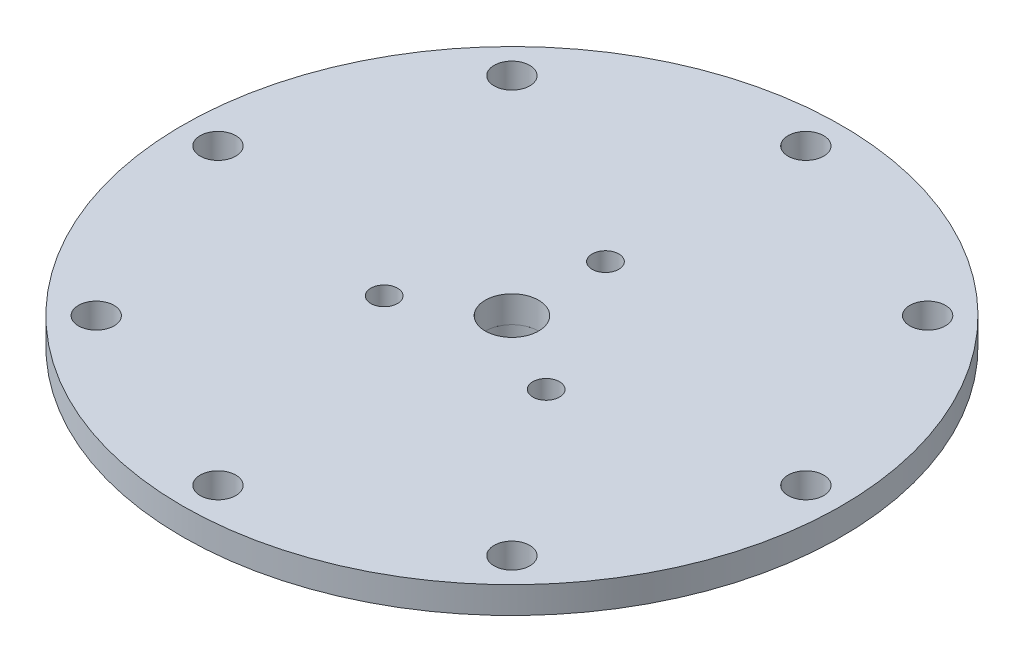
ISO-10303-21;
HEADER;
FILE_DESCRIPTION(('STEP AP214'),'2;1');
FILE_NAME('part.step','',(''),(''),'','','');
FILE_SCHEMA(('AUTOMOTIVE_DESIGN { 1 0 10303 214 1 1 1 1 }'));
ENDSEC;
DATA;
#1=APPLICATION_CONTEXT('core data for automotive mechanical design processes');
#2=APPLICATION_PROTOCOL_DEFINITION('international standard','automotive_design',2000,#1);
#3=PRODUCT_CONTEXT('',#1,'mechanical');
#4=PRODUCT('Part','Part','',(#3));
#5=PRODUCT_RELATED_PRODUCT_CATEGORY('part','',(#4));
#6=PRODUCT_DEFINITION_FORMATION('','',#4);
#7=PRODUCT_DEFINITION_CONTEXT('part definition',#1,'design');
#8=PRODUCT_DEFINITION('design','',#6,#7);
#9=PRODUCT_DEFINITION_SHAPE('','',#8);
#10=(LENGTH_UNIT() NAMED_UNIT(*) SI_UNIT(.MILLI.,.METRE.));
#11=(NAMED_UNIT(*) PLANE_ANGLE_UNIT() SI_UNIT($,.RADIAN.));
#12=(NAMED_UNIT(*) SI_UNIT($,.STERADIAN.) SOLID_ANGLE_UNIT());
#13=UNCERTAINTY_MEASURE_WITH_UNIT(LENGTH_MEASURE(1.E-05),#10,'distance_accuracy_value','');
#14=(GEOMETRIC_REPRESENTATION_CONTEXT(3) GLOBAL_UNCERTAINTY_ASSIGNED_CONTEXT((#13)) GLOBAL_UNIT_ASSIGNED_CONTEXT((#10,
#11,#12)) REPRESENTATION_CONTEXT('',''));
#15=CARTESIAN_POINT('',(0.,0.,0.));
#16=DIRECTION('',(0.,0.,1.));
#17=DIRECTION('',(1.,0.,0.));
#18=AXIS2_PLACEMENT_3D('',#15,#16,#17);
#19=CARTESIAN_POINT('',(0.,-6.23678090575275,0.));
#20=DIRECTION('',(0.,1.,0.));
#21=DIRECTION('',(0.,0.,1.));
#22=AXIS2_PLACEMENT_3D('',#19,#20,#21);
#23=PLANE('',#22);
#24=CARTESIAN_POINT('',(0.,-6.23678090575275,-33.));
#25=DIRECTION('',(0.,1.,0.));
#26=DIRECTION('',(0.,0.,1.));
#27=AXIS2_PLACEMENT_3D('',#24,#25,#26);
#28=CIRCLE('',#27,2.);
#29=CARTESIAN_POINT('',(0.,-6.23678090575275,-31.));
#30=VERTEX_POINT('',#29);
#31=EDGE_CURVE('E113',#30,#30,#28,.T.);
#32=ORIENTED_EDGE('',*,*,#31,.F.);
#33=EDGE_LOOP('',(#32));
#34=FACE_BOUND('',#33,.T.);
#35=CARTESIAN_POINT('',(-33.,-6.23678090575275,0.));
#36=DIRECTION('',(0.,1.,0.));
#37=DIRECTION('',(0.,0.,1.));
#38=AXIS2_PLACEMENT_3D('',#35,#36,#37);
#39=CIRCLE('',#38,2.00000000000001);
#40=CARTESIAN_POINT('',(-33.,-6.23678090575275,2.00000000000001));
#41=VERTEX_POINT('',#40);
#42=EDGE_CURVE('E101',#41,#41,#39,.T.);
#43=ORIENTED_EDGE('',*,*,#42,.F.);
#44=EDGE_LOOP('',(#43));
#45=FACE_BOUND('',#44,.T.);
#46=CARTESIAN_POINT('',(0.,-6.23678090575275,33.));
#47=DIRECTION('',(0.,1.,0.));
#48=DIRECTION('',(0.,0.,1.));
#49=AXIS2_PLACEMENT_3D('',#46,#47,#48);
#50=CIRCLE('',#49,2.);
#51=CARTESIAN_POINT('',(0.,-6.23678090575275,35.));
#52=VERTEX_POINT('',#51);
#53=EDGE_CURVE('E89',#52,#52,#50,.T.);
#54=ORIENTED_EDGE('',*,*,#53,.F.);
#55=EDGE_LOOP('',(#54));
#56=FACE_BOUND('',#55,.T.);
#57=CARTESIAN_POINT('',(33.,-6.23678090575275,0.));
#58=DIRECTION('',(0.,1.,0.));
#59=DIRECTION('',(0.,0.,1.));
#60=AXIS2_PLACEMENT_3D('',#57,#58,#59);
#61=CIRCLE('',#60,2.);
#62=CARTESIAN_POINT('',(33.,-6.23678090575275,2.));
#63=VERTEX_POINT('',#62);
#64=EDGE_CURVE('E77',#63,#63,#61,.T.);
#65=ORIENTED_EDGE('',*,*,#64,.F.);
#66=EDGE_LOOP('',(#65));
#67=FACE_BOUND('',#66,.T.);
#68=CARTESIAN_POINT('',(-9.09326673973658,-6.23678090575275,5.25000000000004));
#69=DIRECTION('',(0.,1.,0.));
#70=DIRECTION('',(0.,0.,1.));
#71=AXIS2_PLACEMENT_3D('',#68,#69,#70);
#72=CIRCLE('',#71,1.5);
#73=CARTESIAN_POINT('',(-9.09326673973658,-6.23678090575275,6.75000000000005));
#74=VERTEX_POINT('',#73);
#75=EDGE_CURVE('E65',#74,#74,#72,.T.);
#76=ORIENTED_EDGE('',*,*,#75,.F.);
#77=EDGE_LOOP('',(#76));
#78=FACE_BOUND('',#77,.T.);
#79=CARTESIAN_POINT('',(0.,-6.23678090575275,-10.5));
#80=DIRECTION('',(0.,1.,0.));
#81=DIRECTION('',(0.,0.,1.));
#82=AXIS2_PLACEMENT_3D('',#79,#80,#81);
#83=CIRCLE('',#82,1.5);
#84=CARTESIAN_POINT('',(0.,-6.23678090575275,-9.));
#85=VERTEX_POINT('',#84);
#86=EDGE_CURVE('E54',#85,#85,#83,.T.);
#87=ORIENTED_EDGE('',*,*,#86,.F.);
#88=EDGE_LOOP('',(#87));
#89=FACE_BOUND('',#88,.T.);
#90=CARTESIAN_POINT('',(0.,-6.23678090575275,0.));
#91=DIRECTION('',(0.,1.,0.));
#92=DIRECTION('',(0.,0.,1.));
#93=AXIS2_PLACEMENT_3D('',#90,#91,#92);
#94=CIRCLE('',#93,37.);
#95=CARTESIAN_POINT('',(0.,-6.23678090575275,37.));
#96=VERTEX_POINT('',#95);
#97=EDGE_CURVE('E11',#96,#96,#94,.T.);
#98=ORIENTED_EDGE('',*,*,#97,.T.);
#99=EDGE_LOOP('',(#98));
#100=FACE_BOUND('',#99,.T.);
#101=CARTESIAN_POINT('',(9.09326673973662,-6.23678090575275,5.24999999999998));
#102=DIRECTION('',(0.,1.,0.));
#103=DIRECTION('',(0.,0.,1.));
#104=AXIS2_PLACEMENT_3D('',#101,#102,#103);
#105=CIRCLE('',#104,1.5);
#106=CARTESIAN_POINT('',(9.09326673973662,-6.23678090575275,6.74999999999998));
#107=VERTEX_POINT('',#106);
#108=EDGE_CURVE('E59',#107,#107,#105,.T.);
#109=ORIENTED_EDGE('',*,*,#108,.F.);
#110=EDGE_LOOP('',(#109));
#111=FACE_BOUND('',#110,.T.);
#112=CARTESIAN_POINT('',(0.,-6.23678090575275,0.));
#113=DIRECTION('',(0.,1.,0.));
#114=DIRECTION('',(0.,0.,1.));
#115=AXIS2_PLACEMENT_3D('',#112,#113,#114);
#116=CIRCLE('',#115,3.);
#117=CARTESIAN_POINT('',(0.,-6.23678090575275,3.));
#118=VERTEX_POINT('',#117);
#119=EDGE_CURVE('E71',#118,#118,#116,.T.);
#120=ORIENTED_EDGE('',*,*,#119,.F.);
#121=EDGE_LOOP('',(#120));
#122=FACE_BOUND('',#121,.T.);
#123=CARTESIAN_POINT('',(23.3345237791561,-6.23678090575275,23.3345237791561));
#124=DIRECTION('',(0.,1.,0.));
#125=DIRECTION('',(0.,0.,1.));
#126=AXIS2_PLACEMENT_3D('',#123,#124,#125);
#127=CIRCLE('',#126,2.00000000000001);
#128=CARTESIAN_POINT('',(23.3345237791561,-6.23678090575275,25.3345237791561));
#129=VERTEX_POINT('',#128);
#130=EDGE_CURVE('E83',#129,#129,#127,.T.);
#131=ORIENTED_EDGE('',*,*,#130,.F.);
#132=EDGE_LOOP('',(#131));
#133=FACE_BOUND('',#132,.T.);
#134=CARTESIAN_POINT('',(-23.3345237791561,-6.23678090575275,23.3345237791561));
#135=DIRECTION('',(0.,1.,0.));
#136=DIRECTION('',(0.,0.,1.));
#137=AXIS2_PLACEMENT_3D('',#134,#135,#136);
#138=CIRCLE('',#137,2.00000000000001);
#139=CARTESIAN_POINT('',(-23.3345237791561,-6.23678090575275,25.3345237791561));
#140=VERTEX_POINT('',#139);
#141=EDGE_CURVE('E95',#140,#140,#138,.T.);
#142=ORIENTED_EDGE('',*,*,#141,.F.);
#143=EDGE_LOOP('',(#142));
#144=FACE_BOUND('',#143,.T.);
#145=CARTESIAN_POINT('',(-23.3345237791561,-6.23678090575275,-23.3345237791561));
#146=DIRECTION('',(0.,1.,0.));
#147=DIRECTION('',(0.,0.,1.));
#148=AXIS2_PLACEMENT_3D('',#145,#146,#147);
#149=CIRCLE('',#148,2.00000000000001);
#150=CARTESIAN_POINT('',(-23.3345237791561,-6.23678090575275,-21.3345237791561));
#151=VERTEX_POINT('',#150);
#152=EDGE_CURVE('E107',#151,#151,#149,.T.);
#153=ORIENTED_EDGE('',*,*,#152,.F.);
#154=EDGE_LOOP('',(#153));
#155=FACE_BOUND('',#154,.T.);
#156=CARTESIAN_POINT('',(23.3345237791561,-6.23678090575275,-23.3345237791561));
#157=DIRECTION('',(0.,1.,0.));
#158=DIRECTION('',(0.,0.,1.));
#159=AXIS2_PLACEMENT_3D('',#156,#157,#158);
#160=CIRCLE('',#159,2.);
#161=CARTESIAN_POINT('',(23.3345237791561,-6.23678090575275,-21.3345237791561));
#162=VERTEX_POINT('',#161);
#163=EDGE_CURVE('E119',#162,#162,#160,.T.);
#164=ORIENTED_EDGE('',*,*,#163,.F.);
#165=EDGE_LOOP('',(#164));
#166=FACE_BOUND('',#165,.T.);
#167=ADVANCED_FACE('F43',(#34,#45,#56,#67,#78,#89,#100,#111,#122,#133,#144,#155,#166),#23,.T.);
#168=CARTESIAN_POINT('',(0.,-9.23678090575275,0.));
#169=DIRECTION('',(0.,1.,0.));
#170=DIRECTION('',(0.,0.,1.));
#171=AXIS2_PLACEMENT_3D('',#168,#169,#170);
#172=PLANE('',#171);
#173=CARTESIAN_POINT('',(0.,-9.23678090575275,0.));
#174=DIRECTION('',(0.,1.,0.));
#175=DIRECTION('',(0.,0.,1.));
#176=AXIS2_PLACEMENT_3D('',#173,#174,#175);
#177=CIRCLE('',#176,37.);
#178=CARTESIAN_POINT('',(0.,-9.23678090575275,37.));
#179=VERTEX_POINT('',#178);
#180=EDGE_CURVE('E47',#179,#179,#177,.T.);
#181=ORIENTED_EDGE('',*,*,#180,.F.);
#182=EDGE_LOOP('',(#181));
#183=FACE_BOUND('',#182,.T.);
#184=CARTESIAN_POINT('',(0.,-9.23678090575275,-10.5));
#185=DIRECTION('',(0.,1.,0.));
#186=DIRECTION('',(0.,0.,1.));
#187=AXIS2_PLACEMENT_3D('',#184,#185,#186);
#188=CIRCLE('',#187,1.5);
#189=CARTESIAN_POINT('',(0.,-9.23678090575275,-9.));
#190=VERTEX_POINT('',#189);
#191=EDGE_CURVE('E56',#190,#190,#188,.T.);
#192=ORIENTED_EDGE('',*,*,#191,.T.);
#193=EDGE_LOOP('',(#192));
#194=FACE_BOUND('',#193,.T.);
#195=CARTESIAN_POINT('',(9.09326673973662,-9.23678090575275,5.24999999999998));
#196=DIRECTION('',(0.,1.,0.));
#197=DIRECTION('',(0.,0.,1.));
#198=AXIS2_PLACEMENT_3D('',#195,#196,#197);
#199=CIRCLE('',#198,1.5);
#200=CARTESIAN_POINT('',(9.09326673973662,-9.23678090575275,6.74999999999998));
#201=VERTEX_POINT('',#200);
#202=EDGE_CURVE('E62',#201,#201,#199,.T.);
#203=ORIENTED_EDGE('',*,*,#202,.T.);
#204=EDGE_LOOP('',(#203));
#205=FACE_BOUND('',#204,.T.);
#206=CARTESIAN_POINT('',(-9.09326673973658,-9.23678090575275,5.25000000000004));
#207=DIRECTION('',(0.,1.,0.));
#208=DIRECTION('',(0.,0.,1.));
#209=AXIS2_PLACEMENT_3D('',#206,#207,#208);
#210=CIRCLE('',#209,1.5);
#211=CARTESIAN_POINT('',(-9.09326673973658,-9.23678090575275,6.75000000000005));
#212=VERTEX_POINT('',#211);
#213=EDGE_CURVE('E68',#212,#212,#210,.T.);
#214=ORIENTED_EDGE('',*,*,#213,.T.);
#215=EDGE_LOOP('',(#214));
#216=FACE_BOUND('',#215,.T.);
#217=CARTESIAN_POINT('',(0.,-9.23678090575275,0.));
#218=DIRECTION('',(0.,1.,0.));
#219=DIRECTION('',(0.,0.,1.));
#220=AXIS2_PLACEMENT_3D('',#217,#218,#219);
#221=CIRCLE('',#220,3.);
#222=CARTESIAN_POINT('',(0.,-9.23678090575275,3.));
#223=VERTEX_POINT('',#222);
#224=EDGE_CURVE('E74',#223,#223,#221,.T.);
#225=ORIENTED_EDGE('',*,*,#224,.T.);
#226=EDGE_LOOP('',(#225));
#227=FACE_BOUND('',#226,.T.);
#228=CARTESIAN_POINT('',(33.,-9.23678090575275,0.));
#229=DIRECTION('',(0.,1.,0.));
#230=DIRECTION('',(0.,0.,1.));
#231=AXIS2_PLACEMENT_3D('',#228,#229,#230);
#232=CIRCLE('',#231,2.);
#233=CARTESIAN_POINT('',(33.,-9.23678090575275,2.));
#234=VERTEX_POINT('',#233);
#235=EDGE_CURVE('E80',#234,#234,#232,.T.);
#236=ORIENTED_EDGE('',*,*,#235,.T.);
#237=EDGE_LOOP('',(#236));
#238=FACE_BOUND('',#237,.T.);
#239=CARTESIAN_POINT('',(23.3345237791561,-9.23678090575275,23.3345237791561));
#240=DIRECTION('',(0.,1.,0.));
#241=DIRECTION('',(0.,0.,1.));
#242=AXIS2_PLACEMENT_3D('',#239,#240,#241);
#243=CIRCLE('',#242,2.00000000000001);
#244=CARTESIAN_POINT('',(23.3345237791561,-9.23678090575275,25.3345237791561));
#245=VERTEX_POINT('',#244);
#246=EDGE_CURVE('E86',#245,#245,#243,.T.);
#247=ORIENTED_EDGE('',*,*,#246,.T.);
#248=EDGE_LOOP('',(#247));
#249=FACE_BOUND('',#248,.T.);
#250=CARTESIAN_POINT('',(0.,-9.23678090575275,33.));
#251=DIRECTION('',(0.,1.,0.));
#252=DIRECTION('',(0.,0.,1.));
#253=AXIS2_PLACEMENT_3D('',#250,#251,#252);
#254=CIRCLE('',#253,2.);
#255=CARTESIAN_POINT('',(0.,-9.23678090575275,35.));
#256=VERTEX_POINT('',#255);
#257=EDGE_CURVE('E92',#256,#256,#254,.T.);
#258=ORIENTED_EDGE('',*,*,#257,.T.);
#259=EDGE_LOOP('',(#258));
#260=FACE_BOUND('',#259,.T.);
#261=CARTESIAN_POINT('',(-23.3345237791561,-9.23678090575275,23.3345237791561));
#262=DIRECTION('',(0.,1.,0.));
#263=DIRECTION('',(0.,0.,1.));
#264=AXIS2_PLACEMENT_3D('',#261,#262,#263);
#265=CIRCLE('',#264,2.00000000000001);
#266=CARTESIAN_POINT('',(-23.3345237791561,-9.23678090575275,25.3345237791561));
#267=VERTEX_POINT('',#266);
#268=EDGE_CURVE('E98',#267,#267,#265,.T.);
#269=ORIENTED_EDGE('',*,*,#268,.T.);
#270=EDGE_LOOP('',(#269));
#271=FACE_BOUND('',#270,.T.);
#272=CARTESIAN_POINT('',(-33.,-9.23678090575275,0.));
#273=DIRECTION('',(0.,1.,0.));
#274=DIRECTION('',(0.,0.,1.));
#275=AXIS2_PLACEMENT_3D('',#272,#273,#274);
#276=CIRCLE('',#275,2.00000000000001);
#277=CARTESIAN_POINT('',(-33.,-9.23678090575275,2.00000000000001));
#278=VERTEX_POINT('',#277);
#279=EDGE_CURVE('E104',#278,#278,#276,.T.);
#280=ORIENTED_EDGE('',*,*,#279,.T.);
#281=EDGE_LOOP('',(#280));
#282=FACE_BOUND('',#281,.T.);
#283=CARTESIAN_POINT('',(-23.3345237791561,-9.23678090575275,-23.3345237791561));
#284=DIRECTION('',(0.,1.,0.));
#285=DIRECTION('',(0.,0.,1.));
#286=AXIS2_PLACEMENT_3D('',#283,#284,#285);
#287=CIRCLE('',#286,2.00000000000001);
#288=CARTESIAN_POINT('',(-23.3345237791561,-9.23678090575275,-21.3345237791561));
#289=VERTEX_POINT('',#288);
#290=EDGE_CURVE('E110',#289,#289,#287,.T.);
#291=ORIENTED_EDGE('',*,*,#290,.T.);
#292=EDGE_LOOP('',(#291));
#293=FACE_BOUND('',#292,.T.);
#294=CARTESIAN_POINT('',(0.,-9.23678090575275,-33.));
#295=DIRECTION('',(0.,1.,0.));
#296=DIRECTION('',(0.,0.,1.));
#297=AXIS2_PLACEMENT_3D('',#294,#295,#296);
#298=CIRCLE('',#297,2.);
#299=CARTESIAN_POINT('',(0.,-9.23678090575275,-31.));
#300=VERTEX_POINT('',#299);
#301=EDGE_CURVE('E116',#300,#300,#298,.T.);
#302=ORIENTED_EDGE('',*,*,#301,.T.);
#303=EDGE_LOOP('',(#302));
#304=FACE_BOUND('',#303,.T.);
#305=CARTESIAN_POINT('',(23.3345237791561,-9.23678090575275,-23.3345237791561));
#306=DIRECTION('',(0.,1.,0.));
#307=DIRECTION('',(0.,0.,1.));
#308=AXIS2_PLACEMENT_3D('',#305,#306,#307);
#309=CIRCLE('',#308,2.);
#310=CARTESIAN_POINT('',(23.3345237791561,-9.23678090575275,-21.3345237791561));
#311=VERTEX_POINT('',#310);
#312=EDGE_CURVE('E122',#311,#311,#309,.T.);
#313=ORIENTED_EDGE('',*,*,#312,.T.);
#314=EDGE_LOOP('',(#313));
#315=FACE_BOUND('',#314,.T.);
#316=ADVANCED_FACE('F132',(#183,#194,#205,#216,#227,#238,#249,#260,#271,#282,#293,#304,#315),
#172,.F.);
#317=CARTESIAN_POINT('',(0.,-6.23678090575275,0.));
#318=DIRECTION('',(0.,-1.,0.));
#319=DIRECTION('',(0.,0.,-1.));
#320=AXIS2_PLACEMENT_3D('',#317,#318,#319);
#321=CYLINDRICAL_SURFACE('',#320,37.);
#322=ORIENTED_EDGE('',*,*,#97,.F.);
#323=EDGE_LOOP('',(#322));
#324=FACE_BOUND('',#323,.T.);
#325=ORIENTED_EDGE('',*,*,#180,.T.);
#326=EDGE_LOOP('',(#325));
#327=FACE_BOUND('',#326,.T.);
#328=ADVANCED_FACE('F45',(#324,#327),#321,.T.);
#329=CARTESIAN_POINT('',(0.,-6.23678090575275,-10.5));
#330=DIRECTION('',(0.,-1.,0.));
#331=DIRECTION('',(0.,0.,-1.));
#332=AXIS2_PLACEMENT_3D('',#329,#330,#331);
#333=CYLINDRICAL_SURFACE('',#332,1.5);
#334=ORIENTED_EDGE('',*,*,#86,.T.);
#335=EDGE_LOOP('',(#334));
#336=FACE_BOUND('',#335,.T.);
#337=ORIENTED_EDGE('',*,*,#191,.F.);
#338=EDGE_LOOP('',(#337));
#339=FACE_BOUND('',#338,.T.);
#340=ADVANCED_FACE('F142',(#336,#339),#333,.F.);
#341=CARTESIAN_POINT('',(9.09326673973662,-6.23678090575275,5.24999999999998));
#342=DIRECTION('',(0.,-1.,0.));
#343=DIRECTION('',(0.,0.,-1.));
#344=AXIS2_PLACEMENT_3D('',#341,#342,#343);
#345=CYLINDRICAL_SURFACE('',#344,1.5);
#346=ORIENTED_EDGE('',*,*,#108,.T.);
#347=EDGE_LOOP('',(#346));
#348=FACE_BOUND('',#347,.T.);
#349=ORIENTED_EDGE('',*,*,#202,.F.);
#350=EDGE_LOOP('',(#349));
#351=FACE_BOUND('',#350,.T.);
#352=ADVANCED_FACE('F145',(#348,#351),#345,.F.);
#353=CARTESIAN_POINT('',(-9.09326673973658,-6.23678090575275,5.25000000000004));
#354=DIRECTION('',(0.,-1.,0.));
#355=DIRECTION('',(0.,0.,-1.));
#356=AXIS2_PLACEMENT_3D('',#353,#354,#355);
#357=CYLINDRICAL_SURFACE('',#356,1.5);
#358=ORIENTED_EDGE('',*,*,#75,.T.);
#359=EDGE_LOOP('',(#358));
#360=FACE_BOUND('',#359,.T.);
#361=ORIENTED_EDGE('',*,*,#213,.F.);
#362=EDGE_LOOP('',(#361));
#363=FACE_BOUND('',#362,.T.);
#364=ADVANCED_FACE('F149',(#360,#363),#357,.F.);
#365=CARTESIAN_POINT('',(0.,-6.23678090575275,0.));
#366=DIRECTION('',(0.,-1.,0.));
#367=DIRECTION('',(0.,0.,-1.));
#368=AXIS2_PLACEMENT_3D('',#365,#366,#367);
#369=CYLINDRICAL_SURFACE('',#368,3.);
#370=ORIENTED_EDGE('',*,*,#119,.T.);
#371=EDGE_LOOP('',(#370));
#372=FACE_BOUND('',#371,.T.);
#373=ORIENTED_EDGE('',*,*,#224,.F.);
#374=EDGE_LOOP('',(#373));
#375=FACE_BOUND('',#374,.T.);
#376=ADVANCED_FACE('F153',(#372,#375),#369,.F.);
#377=CARTESIAN_POINT('',(33.,-6.23678090575275,0.));
#378=DIRECTION('',(0.,-1.,0.));
#379=DIRECTION('',(0.,0.,-1.));
#380=AXIS2_PLACEMENT_3D('',#377,#378,#379);
#381=CYLINDRICAL_SURFACE('',#380,2.);
#382=ORIENTED_EDGE('',*,*,#64,.T.);
#383=EDGE_LOOP('',(#382));
#384=FACE_BOUND('',#383,.T.);
#385=ORIENTED_EDGE('',*,*,#235,.F.);
#386=EDGE_LOOP('',(#385));
#387=FACE_BOUND('',#386,.T.);
#388=ADVANCED_FACE('F157',(#384,#387),#381,.F.);
#389=CARTESIAN_POINT('',(23.3345237791561,-6.23678090575275,23.3345237791561));
#390=DIRECTION('',(0.,-1.,0.));
#391=DIRECTION('',(0.,0.,-1.));
#392=AXIS2_PLACEMENT_3D('',#389,#390,#391);
#393=CYLINDRICAL_SURFACE('',#392,2.00000000000001);
#394=ORIENTED_EDGE('',*,*,#130,.T.);
#395=EDGE_LOOP('',(#394));
#396=FACE_BOUND('',#395,.T.);
#397=ORIENTED_EDGE('',*,*,#246,.F.);
#398=EDGE_LOOP('',(#397));
#399=FACE_BOUND('',#398,.T.);
#400=ADVANCED_FACE('F161',(#396,#399),#393,.F.);
#401=CARTESIAN_POINT('',(0.,-6.23678090575275,33.));
#402=DIRECTION('',(0.,-1.,0.));
#403=DIRECTION('',(0.,0.,-1.));
#404=AXIS2_PLACEMENT_3D('',#401,#402,#403);
#405=CYLINDRICAL_SURFACE('',#404,2.);
#406=ORIENTED_EDGE('',*,*,#53,.T.);
#407=EDGE_LOOP('',(#406));
#408=FACE_BOUND('',#407,.T.);
#409=ORIENTED_EDGE('',*,*,#257,.F.);
#410=EDGE_LOOP('',(#409));
#411=FACE_BOUND('',#410,.T.);
#412=ADVANCED_FACE('F165',(#408,#411),#405,.F.);
#413=CARTESIAN_POINT('',(-23.3345237791561,-6.23678090575275,23.3345237791561));
#414=DIRECTION('',(0.,-1.,0.));
#415=DIRECTION('',(0.,0.,-1.));
#416=AXIS2_PLACEMENT_3D('',#413,#414,#415);
#417=CYLINDRICAL_SURFACE('',#416,2.00000000000001);
#418=ORIENTED_EDGE('',*,*,#141,.T.);
#419=EDGE_LOOP('',(#418));
#420=FACE_BOUND('',#419,.T.);
#421=ORIENTED_EDGE('',*,*,#268,.F.);
#422=EDGE_LOOP('',(#421));
#423=FACE_BOUND('',#422,.T.);
#424=ADVANCED_FACE('F169',(#420,#423),#417,.F.);
#425=CARTESIAN_POINT('',(-33.,-6.23678090575275,0.));
#426=DIRECTION('',(0.,-1.,0.));
#427=DIRECTION('',(0.,0.,-1.));
#428=AXIS2_PLACEMENT_3D('',#425,#426,#427);
#429=CYLINDRICAL_SURFACE('',#428,2.00000000000001);
#430=ORIENTED_EDGE('',*,*,#42,.T.);
#431=EDGE_LOOP('',(#430));
#432=FACE_BOUND('',#431,.T.);
#433=ORIENTED_EDGE('',*,*,#279,.F.);
#434=EDGE_LOOP('',(#433));
#435=FACE_BOUND('',#434,.T.);
#436=ADVANCED_FACE('F173',(#432,#435),#429,.F.);
#437=CARTESIAN_POINT('',(-23.3345237791561,-6.23678090575275,-23.3345237791561));
#438=DIRECTION('',(0.,-1.,0.));
#439=DIRECTION('',(0.,0.,-1.));
#440=AXIS2_PLACEMENT_3D('',#437,#438,#439);
#441=CYLINDRICAL_SURFACE('',#440,2.00000000000001);
#442=ORIENTED_EDGE('',*,*,#152,.T.);
#443=EDGE_LOOP('',(#442));
#444=FACE_BOUND('',#443,.T.);
#445=ORIENTED_EDGE('',*,*,#290,.F.);
#446=EDGE_LOOP('',(#445));
#447=FACE_BOUND('',#446,.T.);
#448=ADVANCED_FACE('F177',(#444,#447),#441,.F.);
#449=CARTESIAN_POINT('',(0.,-6.23678090575275,-33.));
#450=DIRECTION('',(0.,-1.,0.));
#451=DIRECTION('',(0.,0.,-1.));
#452=AXIS2_PLACEMENT_3D('',#449,#450,#451);
#453=CYLINDRICAL_SURFACE('',#452,2.);
#454=ORIENTED_EDGE('',*,*,#31,.T.);
#455=EDGE_LOOP('',(#454));
#456=FACE_BOUND('',#455,.T.);
#457=ORIENTED_EDGE('',*,*,#301,.F.);
#458=EDGE_LOOP('',(#457));
#459=FACE_BOUND('',#458,.T.);
#460=ADVANCED_FACE('F181',(#456,#459),#453,.F.);
#461=CARTESIAN_POINT('',(23.3345237791561,-6.23678090575275,-23.3345237791561));
#462=DIRECTION('',(0.,-1.,0.));
#463=DIRECTION('',(0.,0.,-1.));
#464=AXIS2_PLACEMENT_3D('',#461,#462,#463);
#465=CYLINDRICAL_SURFACE('',#464,2.);
#466=ORIENTED_EDGE('',*,*,#163,.T.);
#467=EDGE_LOOP('',(#466));
#468=FACE_BOUND('',#467,.T.);
#469=ORIENTED_EDGE('',*,*,#312,.F.);
#470=EDGE_LOOP('',(#469));
#471=FACE_BOUND('',#470,.T.);
#472=ADVANCED_FACE('F128',(#468,#471),#465,.F.);
#473=CLOSED_SHELL('',(#167,#316,#328,#340,#352,#364,#376,#388,#400,#412,#424,#436,#448,#460,#472));
#474=MANIFOLD_SOLID_BREP('B2',#473);
#475=CARTESIAN_POINT('',(0.,-25.2367809057528,0.));
#476=DIRECTION('',(0.,-1.,0.));
#477=DIRECTION('',(0.,0.,-1.));
#478=AXIS2_PLACEMENT_3D('',#475,#476,#477);
#479=CYLINDRICAL_SURFACE('',#478,3.);
#480=CARTESIAN_POINT('',(0.,-9.23678090575275,0.));
#481=DIRECTION('',(0.,-1.,0.));
#482=DIRECTION('',(0.,0.,-1.));
#483=AXIS2_PLACEMENT_3D('',#480,#481,#482);
#484=CIRCLE('',#483,3.);
#485=CARTESIAN_POINT('',(0.,-9.23678090575275,-3.));
#486=VERTEX_POINT('',#485);
#487=EDGE_CURVE('E348',#486,#486,#484,.T.);
#488=ORIENTED_EDGE('',*,*,#487,.F.);
#489=EDGE_LOOP('',(#488));
#490=FACE_BOUND('',#489,.T.);
#491=CARTESIAN_POINT('',(0.,-25.2367809057528,0.));
#492=DIRECTION('',(0.,-1.,0.));
#493=DIRECTION('',(0.,0.,-1.));
#494=AXIS2_PLACEMENT_3D('',#491,#492,#493);
#495=CIRCLE('',#494,3.);
#496=CARTESIAN_POINT('',(0.,-25.2367809057528,-3.));
#497=VERTEX_POINT('',#496);
#498=EDGE_CURVE('E42',#497,#497,#495,.T.);
#499=ORIENTED_EDGE('',*,*,#498,.T.);
#500=EDGE_LOOP('',(#499));
#501=FACE_BOUND('',#500,.T.);
#502=CARTESIAN_POINT('',(-2.,-17.2367809057528,2.23606797749979));
#503=CARTESIAN_POINT('',(-1.99999453997731,-17.1391525948841,2.23607753462817));
#504=CARTESIAN_POINT('',(-1.99278992503664,-17.0414901520439,2.24258071047442));
#505=CARTESIAN_POINT('',(-1.96458268317731,-16.8496609941019,2.26731972501617));
#506=CARTESIAN_POINT('',(-1.94355530587862,-16.7555008702232,2.2855766081271));
#507=CARTESIAN_POINT('',(-1.88935861676632,-16.5740454638751,2.3305658582557));
#508=CARTESIAN_POINT('',(-1.85630718014214,-16.4866932090151,2.35721561794602));
#509=CARTESIAN_POINT('',(-1.77934008393538,-16.3189150734061,2.41584094681825));
#510=CARTESIAN_POINT('',(-1.73542216812163,-16.2384906357763,2.44781762158831));
#511=CARTESIAN_POINT('',(-1.63002410007714,-16.0731340181358,2.51946072932026));
#512=CARTESIAN_POINT('',(-1.56687435451732,-15.9894487880356,2.55954936090364));
#513=CARTESIAN_POINT('',(-1.4281921974068,-15.8327781968785,2.63944827308083));
#514=CARTESIAN_POINT('',(-1.3526477317708,-15.7598033840942,2.67925824297985));
#515=CARTESIAN_POINT('',(-1.17815690494295,-15.6161372469711,2.76088818523747));
#516=CARTESIAN_POINT('',(-1.07740643965819,-15.5472983939771,2.80216785846923));
#517=CARTESIAN_POINT('',(-0.862470964212233,-15.4281388102627,2.87558484482764));
#518=CARTESIAN_POINT('',(-0.748301152321704,-15.3777973917216,2.90773236231037));
#519=CARTESIAN_POINT('',(-0.523249073480004,-15.3032245047353,2.95599907464725));
#520=CARTESIAN_POINT('',(-0.413434725181417,-15.2766975612572,2.97351175615867));
#521=CARTESIAN_POINT('',(-0.189695448729863,-15.2425964164691,2.99609745461921));
#522=CARTESIAN_POINT('',(-0.0757758812858258,-15.2349983465273,3.00118613762359));
#523=CARTESIAN_POINT('',(0.134147050232329,-15.2389533557018,2.99855361722953));
#524=CARTESIAN_POINT('',(0.230240638008752,-15.2477699570698,2.99266264910127));
#525=CARTESIAN_POINT('',(0.419238633271014,-15.2788719571117,2.9720818279002));
#526=CARTESIAN_POINT('',(0.512142807649723,-15.3011583380563,2.95739133313102));
#527=CARTESIAN_POINT('',(0.692077937671168,-15.3579765905473,2.92052091703736));
#528=CARTESIAN_POINT('',(0.779130623845961,-15.3924597909513,2.89837077982679));
#529=CARTESIAN_POINT('',(0.946209150653556,-15.4723345487056,2.84821104476287));
#530=CARTESIAN_POINT('',(1.0262337049694,-15.5177280972543,2.82020037745161));
#531=CARTESIAN_POINT('',(1.18828429196344,-15.6247596432126,2.75618058450702));
#532=CARTESIAN_POINT('',(1.26919148099708,-15.6877484291055,2.71960408792025));
#533=CARTESIAN_POINT('',(1.41998807498305,-15.8246795852331,2.64400601826998));
#534=CARTESIAN_POINT('',(1.48986013519457,-15.8986388516866,2.60498072815232));
#535=CARTESIAN_POINT('',(1.62772235326165,-16.068744115966,2.52150044944152));
#536=CARTESIAN_POINT('',(1.69373593126354,-16.1665519854672,2.47714320008932));
#537=CARTESIAN_POINT('',(1.80834874945482,-16.3742907449735,2.39475610831095));
#538=CARTESIAN_POINT('',(1.85697718654898,-16.4842009001666,2.3567157153489));
#539=CARTESIAN_POINT('',(1.92332724567776,-16.6814999678259,2.30262870306889));
#540=CARTESIAN_POINT('',(1.94590791747533,-16.7663742758096,2.28340364577668));
#541=CARTESIAN_POINT('',(1.97979555580014,-16.9398203955696,2.25409039789612));
#542=CARTESIAN_POINT('',(1.99112206964395,-17.0283855169254,2.24398636782354));
#543=CARTESIAN_POINT('',(2.00179400148877,-17.2072238921942,2.23447556987372));
#544=CARTESIAN_POINT('',(2.00108729753098,-17.2975028842729,2.2351153386647));
#545=CARTESIAN_POINT('',(1.98761629716365,-17.4764647397078,2.24709880368953));
#546=CARTESIAN_POINT('',(1.97484222690381,-17.5651462498601,2.25845117648851));
#547=CARTESIAN_POINT('',(1.93899811187046,-17.7341703233026,2.28927977500746));
#548=CARTESIAN_POINT('',(1.91646174529973,-17.8147086147553,2.30833187069749));
#549=CARTESIAN_POINT('',(1.86223041628513,-17.970907141803,2.3522995853365));
#550=CARTESIAN_POINT('',(1.83053237805351,-18.0465657287158,2.3772171729463));
#551=CARTESIAN_POINT('',(1.75163346599563,-18.2069829096003,2.43611483596194));
#552=CARTESIAN_POINT('',(1.70260028818246,-18.2905377172954,2.47091081434316));
#553=CARTESIAN_POINT('',(1.59352731501438,-18.44919770837,2.54262514806633));
#554=CARTESIAN_POINT('',(1.53347411883827,-18.5242924224952,2.57954604947543));
#555=CARTESIAN_POINT('',(1.38876657712435,-18.6807432532203,2.66075678321007));
#556=CARTESIAN_POINT('',(1.30160386514207,-18.7598837540011,2.70489452138573));
#557=CARTESIAN_POINT('',(1.11309948866219,-18.902597588693,2.78775581841638));
#558=CARTESIAN_POINT('',(1.011770477457,-18.9661846770095,2.82648414789457));
#559=CARTESIAN_POINT('',(0.817487474821797,-19.0646726446703,2.88790821242222));
#560=CARTESIAN_POINT('',(0.72666236488632,-19.1027374101931,2.91225458111008));
#561=CARTESIAN_POINT('',(0.538757079020515,-19.1653881000732,2.95278707867041));
#562=CARTESIAN_POINT('',(0.441682263858769,-19.1899854086125,2.96898009871993));
#563=CARTESIAN_POINT('',(0.243369392303443,-19.2244778695915,2.99178364026746));
#564=CARTESIAN_POINT('',(0.142114836924318,-19.2343075852594,2.99835150856533));
#565=CARTESIAN_POINT('',(-0.0608555465807322,-19.2384287571699,3.00109821029056));
#566=CARTESIAN_POINT('',(-0.162571330953448,-19.2327216577089,2.99727800938901));
#567=CARTESIAN_POINT('',(-0.355757532528105,-19.207121416748,2.98029555977323));
#568=CARTESIAN_POINT('',(-0.447435143070529,-19.1882899208909,2.96783277209856));
#569=CARTESIAN_POINT('',(-0.626018422997061,-19.1385428963219,2.93536106206933));
#570=CARTESIAN_POINT('',(-0.71292334868689,-19.1076254904055,2.91535096747103));
#571=CARTESIAN_POINT('',(-0.88514729660835,-19.0328422008687,2.86791765486194));
#572=CARTESIAN_POINT('',(-0.970083589200263,-18.9883305982577,2.84013248946338));
#573=CARTESIAN_POINT('',(-1.13155266268318,-18.8886302611268,2.77975408235472));
#574=CARTESIAN_POINT('',(-1.20808037205002,-18.8334351378008,2.74715796645263));
#575=CARTESIAN_POINT('',(-1.36329422201402,-18.7041520034164,2.67392931472394));
#576=CARTESIAN_POINT('',(-1.44042679526091,-18.6284578820787,2.6328391387737));
#577=CARTESIAN_POINT('',(-1.58160022281596,-18.4656673642069,2.55053357649486));
#578=CARTESIAN_POINT('',(-1.64563128323923,-18.3785625169187,2.50931811970155));
#579=CARTESIAN_POINT('',(-1.75513253518411,-18.2009133149975,2.43384213590298));
#580=CARTESIAN_POINT('',(-1.8016464689721,-18.1111390958024,2.39929086741904));
#581=CARTESIAN_POINT('',(-1.88115802340272,-17.9234964567596,2.33747501591022));
#582=CARTESIAN_POINT('',(-1.91418190281333,-17.8256442118906,2.31019631295305));
#583=CARTESIAN_POINT('',(-1.95936262470908,-17.6460094373282,2.27191051929539));
#584=CARTESIAN_POINT('',(-1.97452228373248,-17.5654726689625,2.25863695410151));
#585=CARTESIAN_POINT('',(-1.99483915818926,-17.4022245052482,2.24071519216009));
#586=CARTESIAN_POINT('',(-2.00000462703715,-17.3195149614922,2.23605987841475));
#587=CARTESIAN_POINT('',(-2.,-17.2367809057528,2.23606797749979));
#588=B_SPLINE_CURVE_WITH_KNOTS('',3,(#502,#503,#504,#505,#506,#507,#508,#509,#510,#511,#512,
#513,#514,#515,#516,#517,#518,#519,#520,#521,#522,#523,#524,#525,#526,#527,#528,#529,#530,#531,
#532,#533,#534,#535,#536,#537,#538,#539,#540,#541,#542,#543,#544,#545,#546,#547,#548,#549,#550,
#551,#552,#553,#554,#555,#556,#557,#558,#559,#560,#561,#562,#563,#564,#565,#566,#567,#568,#569,
#570,#571,#572,#573,#574,#575,#576,#577,#578,#579,#580,#581,#582,#583,#584,#585,#586,#587),
.UNSPECIFIED.,.T.,.F.,(4,2,2,2,2,2,2,2,2,2,2,2,2,2,2,2,2,2,2,2,2,2,2,2,2,2,2,2,2,2,2,2,2,2,2,2,
2,2,2,2,2,2,4),(0.,0.292506930722154,0.585539042259288,0.875772651216276,1.16606657266549,
1.50154677068638,1.83735518436275,2.22167031006289,2.6055542938858,2.94637482063579,
3.28676536688298,3.57539534955742,3.86404638283746,4.15155831973191,4.43912276903,
4.76447525946635,5.09033414796638,5.46678703504944,5.84260469743948,6.11126090401324,
6.37944966235486,6.64880037638036,6.91836943570598,7.17476451706936,7.43124577644957,
7.73899230052351,8.04711556801509,8.42254684520963,8.7976449057258,9.10070580611698,
9.40351012888472,9.70765229266164,10.0117661844615,10.2937678224973,10.5758132789284,
10.874178629859,11.1727229593109,11.5182220628451,11.863978504186,12.1833412579672,
12.5020793664923,12.7501661630426,12.9980479966543),.UNSPECIFIED.);
#589=CARTESIAN_POINT('',(-2.,-17.2367809057528,2.23606797749979));
#590=VERTEX_POINT('',#589);
#591=EDGE_CURVE('E401',#590,#590,#588,.T.);
#592=ORIENTED_EDGE('',*,*,#591,.F.);
#593=EDGE_LOOP('',(#592));
#594=FACE_BOUND('',#593,.T.);
#595=ADVANCED_FACE('F336',(#490,#501,#594),#479,.F.);
#596=CARTESIAN_POINT('',(0.,-25.2367809057528,0.));
#597=DIRECTION('',(0.,-1.,0.));
#598=DIRECTION('',(0.,0.,-1.));
#599=AXIS2_PLACEMENT_3D('',#596,#597,#598);
#600=CYLINDRICAL_SURFACE('',#599,7.5);
#601=CARTESIAN_POINT('',(0.,-25.2367809057528,0.));
#602=DIRECTION('',(0.,-1.,0.));
#603=DIRECTION('',(0.,0.,-1.));
#604=AXIS2_PLACEMENT_3D('',#601,#602,#603);
#605=CIRCLE('',#604,7.5);
#606=CARTESIAN_POINT('',(0.,-25.2367809057528,-7.5));
#607=VERTEX_POINT('',#606);
#608=EDGE_CURVE('E360',#607,#607,#605,.T.);
#609=ORIENTED_EDGE('',*,*,#608,.F.);
#610=EDGE_LOOP('',(#609));
#611=FACE_BOUND('',#610,.T.);
#612=CARTESIAN_POINT('',(0.,-13.2367809057528,0.));
#613=DIRECTION('',(0.,-1.,0.));
#614=DIRECTION('',(0.,0.,-1.));
#615=AXIS2_PLACEMENT_3D('',#612,#613,#614);
#616=CIRCLE('',#615,7.5);
#617=CARTESIAN_POINT('',(0.,-13.2367809057528,-7.5));
#618=VERTEX_POINT('',#617);
#619=EDGE_CURVE('E379',#618,#618,#616,.T.);
#620=ORIENTED_EDGE('',*,*,#619,.T.);
#621=EDGE_LOOP('',(#620));
#622=FACE_BOUND('',#621,.T.);
#623=CARTESIAN_POINT('',(-2.,-17.2367809057528,7.22841614740048));
#624=CARTESIAN_POINT('',(-1.99999734315871,-17.346956843493,7.22841805697252));
#625=CARTESIAN_POINT('',(-1.99086493224743,-17.4571609062288,7.23096264549673));
#626=CARTESIAN_POINT('',(-1.95464583260237,-17.6743863273091,7.24083561155097));
#627=CARTESIAN_POINT('',(-1.92755013620953,-17.7814060607308,7.24816638907934));
#628=CARTESIAN_POINT('',(-1.85635845560073,-17.9890889756995,7.26672375176839));
#629=CARTESIAN_POINT('',(-1.81228637542178,-18.0897608645812,7.27794485684204));
#630=CARTESIAN_POINT('',(-1.70846784563704,-18.2822976458126,7.30301154920401));
#631=CARTESIAN_POINT('',(-1.6487201784145,-18.3741618532597,7.31685734034424));
#632=CARTESIAN_POINT('',(-1.51364847874559,-18.5487734527405,7.34600139553467));
#633=CARTESIAN_POINT('',(-1.43800297504208,-18.6312679232172,7.36132541116443));
#634=CARTESIAN_POINT('',(-1.27397427284021,-18.7825624827039,7.39147701436507));
#635=CARTESIAN_POINT('',(-1.18558975534664,-18.8513611518945,7.40630455033439));
#636=CARTESIAN_POINT('',(-0.996838170873269,-18.9743658441557,7.43407988468418));
#637=CARTESIAN_POINT('',(-0.896301819879479,-19.0283204243856,7.44699376262293));
#638=CARTESIAN_POINT('',(-0.687183044729091,-19.11846554112,7.46919126211834));
#639=CARTESIAN_POINT('',(-0.578601980875103,-19.1546590730343,7.47847549576262));
#640=CARTESIAN_POINT('',(-0.35911596181009,-19.2074361259885,7.49218553576461));
#641=CARTESIAN_POINT('',(-0.248321224200916,-19.2244498823787,7.49671776750265));
#642=CARTESIAN_POINT('',(-0.0253635535085756,-19.2397380258599,7.50078524617749));
#643=CARTESIAN_POINT('',(0.0867991474385298,-19.2380155493829,7.50032132946608));
#644=CARTESIAN_POINT('',(0.306314237111346,-19.2161830932133,7.49452675859765));
#645=CARTESIAN_POINT('',(0.41371660072111,-19.1965379481165,7.48931914026999));
#646=CARTESIAN_POINT('',(0.623641315571055,-19.1401687679708,7.4747674859047));
#647=CARTESIAN_POINT('',(0.72616338818058,-19.1034437590667,7.46542321400589));
#648=CARTESIAN_POINT('',(0.924603945147554,-19.0136010581604,7.44346569099892));
#649=CARTESIAN_POINT('',(1.02044668632954,-18.960324098652,7.43082087877672));
#650=CARTESIAN_POINT('',(1.20198999876452,-18.8390120862437,7.40362468509504));
#651=CARTESIAN_POINT('',(1.28768858808586,-18.7709741567246,7.38907293223));
#652=CARTESIAN_POINT('',(1.44928536946561,-18.6196040478188,7.35911272938719));
#653=CARTESIAN_POINT('',(1.52480192017774,-18.5358664607034,7.34369169368738));
#654=CARTESIAN_POINT('',(1.6608133210477,-18.3567562295139,7.31413405023521));
#655=CARTESIAN_POINT('',(1.72130725529808,-18.2613828765523,7.29999752083065));
#656=CARTESIAN_POINT('',(1.82584679186274,-18.0608808039314,7.27455902280777));
#657=CARTESIAN_POINT('',(1.86978866600526,-17.9556955548396,7.26327507092156));
#658=CARTESIAN_POINT('',(1.93924001685674,-17.7390544062978,7.24504325087515));
#659=CARTESIAN_POINT('',(1.96475406461341,-17.6276000693024,7.23809430746845));
#660=CARTESIAN_POINT('',(1.99596757092855,-17.4051536947244,7.22954835612976));
#661=CARTESIAN_POINT('',(2.00223632621177,-17.2942473571314,7.22779763213456));
#662=CARTESIAN_POINT('',(1.9963498112297,-17.0729711329442,7.22942578390815));
#663=CARTESIAN_POINT('',(1.98419650172323,-16.9626011905128,7.23280411376438));
#664=CARTESIAN_POINT('',(1.94231271869971,-16.7477243116612,7.24416124318865));
#665=CARTESIAN_POINT('',(1.91292447912922,-16.6431454678155,7.25205039699299));
#666=CARTESIAN_POINT('',(1.83778986725474,-16.4404012743928,7.27145268952784));
#667=CARTESIAN_POINT('',(1.79204135876651,-16.3422367643253,7.28296630148563));
#668=CARTESIAN_POINT('',(1.68432905508707,-16.1527259483175,7.30863572472984));
#669=CARTESIAN_POINT('',(1.62203095237924,-16.061576929863,7.32284404872864));
#670=CARTESIAN_POINT('',(1.48340227987515,-15.8908176040496,7.35217841933666));
#671=CARTESIAN_POINT('',(1.40706907222966,-15.8112094707986,7.36730463810238));
#672=CARTESIAN_POINT('',(1.23990378250484,-15.6634284325028,7.39729964884456));
#673=CARTESIAN_POINT('',(1.14871641600885,-15.5956525287742,7.41214836523848));
#674=CARTESIAN_POINT('',(0.955928435940744,-15.4763699183422,7.43946670017127));
#675=CARTESIAN_POINT('',(0.854328377018885,-15.4248623456738,7.45193644532905));
#676=CARTESIAN_POINT('',(0.644314134825873,-15.3400512733912,7.47301150899261));
#677=CARTESIAN_POINT('',(0.535957852882338,-15.3066118863093,7.48164558480385));
#678=CARTESIAN_POINT('',(0.314899384731321,-15.2584921776884,7.49420303787247));
#679=CARTESIAN_POINT('',(0.202198167320244,-15.2438076989781,7.4981274590498));
#680=CARTESIAN_POINT('',(-0.0206420013461493,-15.2338750820113,7.50077413437691));
#681=CARTESIAN_POINT('',(-0.130753511527864,-15.2380445866216,7.49965226288082));
#682=CARTESIAN_POINT('',(-0.348648304630718,-15.264349399328,7.4926849097886));
#683=CARTESIAN_POINT('',(-0.456431674812814,-15.2864840328698,7.48683960554786));
#684=CARTESIAN_POINT('',(-0.66591012346421,-15.3477615106714,7.47111310390923));
#685=CARTESIAN_POINT('',(-0.76764201185154,-15.3867861992252,7.46125997189229));
#686=CARTESIAN_POINT('',(-0.963172098471354,-15.480630507499,7.43854816516494));
#687=CARTESIAN_POINT('',(-1.05696918166215,-15.5354523423656,7.42568906899253));
#688=CARTESIAN_POINT('',(-1.23667826867367,-15.6610391778898,7.39791331224121));
#689=CARTESIAN_POINT('',(-1.32231336173331,-15.7321902864514,7.38295093371635));
#690=CARTESIAN_POINT('',(-1.48062537156133,-15.8876836551177,7.35284000077256));
#691=CARTESIAN_POINT('',(-1.55329887243048,-15.9720293815721,7.33769139839721));
#692=CARTESIAN_POINT('',(-1.68520700232562,-16.1537493015704,7.30853959638856));
#693=CARTESIAN_POINT('',(-1.74411094261233,-16.25136921941,7.29456891224646));
#694=CARTESIAN_POINT('',(-1.84458689030054,-16.455487216613,7.26981393903472));
#695=CARTESIAN_POINT('',(-1.88617023367332,-16.5619794342922,7.25902756724947));
#696=CARTESIAN_POINT('',(-1.94538124252481,-16.762862241804,7.24336000653874));
#697=CARTESIAN_POINT('',(-1.96581518399489,-16.8563821703095,7.23780140272195));
#698=CARTESIAN_POINT('',(-1.9931249429388,-17.0455214637467,7.2303288521157));
#699=CARTESIAN_POINT('',(-2.0000023063216,-17.1411405880416,7.22841448976016));
#700=CARTESIAN_POINT('',(-2.,-17.2367809057528,7.22841614740048));
#701=B_SPLINE_CURVE_WITH_KNOTS('',3,(#623,#624,#625,#626,#627,#628,#629,#630,#631,#632,#633,
#634,#635,#636,#637,#638,#639,#640,#641,#642,#643,#644,#645,#646,#647,#648,#649,#650,#651,#652,
#653,#654,#655,#656,#657,#658,#659,#660,#661,#662,#663,#664,#665,#666,#667,#668,#669,#670,#671,
#672,#673,#674,#675,#676,#677,#678,#679,#680,#681,#682,#683,#684,#685,#686,#687,#688,#689,#690,
#691,#692,#693,#694,#695,#696,#697,#698,#699,#700),.UNSPECIFIED.,.T.,.F.,(4,2,2,2,2,2,2,2,2,2,2,
2,2,2,2,2,2,2,2,2,2,2,2,2,2,2,2,2,2,2,2,2,2,2,2,2,2,2,4),(0.,0.330176128116026,
0.660517947850201,0.990396311596164,1.32030030656104,1.65765916130211,1.99505297124461,
2.33785207370803,2.68059334304246,3.0154830431648,3.35031668385603,3.67670570800803,
4.00311334440695,4.3327644890557,4.66247993394491,5.0023176230033,5.34217602639579,
5.68413015096536,6.02599942418508,6.35765334242023,6.68927196343503,7.01451850432574,
7.33980752864823,7.67224634967772,8.00474771541474,8.34685906959632,8.68895221008103,
9.028435395914,9.36784331959005,9.69684054916462,10.0258254261296,10.3525451486866,
10.6793107076596,11.0147885399158,11.3503546538105,11.6933003898558,12.0360213210131,
12.3226696767153,12.6092853429065),.UNSPECIFIED.);
#702=CARTESIAN_POINT('',(-2.,-17.2367809057528,7.22841614740048));
#703=VERTEX_POINT('',#702);
#704=EDGE_CURVE('E340',#703,#703,#701,.T.);
#705=ORIENTED_EDGE('',*,*,#704,.F.);
#706=EDGE_LOOP('',(#705));
#707=FACE_BOUND('',#706,.T.);
#708=ADVANCED_FACE('F397',(#611,#622,#707),#600,.T.);
#709=CARTESIAN_POINT('',(-7.5,-25.2367809057528,0.));
#710=DIRECTION('',(0.,1.,0.));
#711=DIRECTION('',(0.,0.,1.));
#712=AXIS2_PLACEMENT_3D('',#709,#710,#711);
#713=PLANE('',#712);
#714=ORIENTED_EDGE('',*,*,#498,.F.);
#715=EDGE_LOOP('',(#714));
#716=FACE_BOUND('',#715,.T.);
#717=ORIENTED_EDGE('',*,*,#608,.T.);
#718=EDGE_LOOP('',(#717));
#719=FACE_BOUND('',#718,.T.);
#720=ADVANCED_FACE('F338',(#716,#719),#713,.F.);
#721=CARTESIAN_POINT('',(-3.,-9.23678090575275,0.));
#722=DIRECTION('',(0.,-1.,0.));
#723=DIRECTION('',(0.,0.,-1.));
#724=AXIS2_PLACEMENT_3D('',#721,#722,#723);
#725=PLANE('',#724);
#726=CARTESIAN_POINT('',(-9.09326673973658,-9.23678090575275,5.25000000000004));
#727=DIRECTION('',(0.,1.,0.));
#728=DIRECTION('',(0.,0.,1.));
#729=AXIS2_PLACEMENT_3D('',#726,#727,#728);
#730=CIRCLE('',#729,1.5);
#731=CARTESIAN_POINT('',(-9.09326673973658,-9.23678090575275,6.75000000000004));
#732=VERTEX_POINT('',#731);
#733=EDGE_CURVE('E365',#732,#732,#730,.T.);
#734=ORIENTED_EDGE('',*,*,#733,.F.);
#735=EDGE_LOOP('',(#734));
#736=FACE_BOUND('',#735,.T.);
#737=CARTESIAN_POINT('',(0.,-9.23678090575275,-10.5));
#738=DIRECTION('',(0.,1.,0.));
#739=DIRECTION('',(0.,0.,1.));
#740=AXIS2_PLACEMENT_3D('',#737,#738,#739);
#741=CIRCLE('',#740,1.5);
#742=CARTESIAN_POINT('',(0.,-9.23678090575275,-9.));
#743=VERTEX_POINT('',#742);
#744=EDGE_CURVE('E375',#743,#743,#741,.T.);
#745=ORIENTED_EDGE('',*,*,#744,.F.);
#746=EDGE_LOOP('',(#745));
#747=FACE_BOUND('',#746,.T.);
#748=CARTESIAN_POINT('',(9.09326673973662,-9.23678090575275,5.24999999999998));
#749=DIRECTION('',(0.,1.,0.));
#750=DIRECTION('',(0.,0.,1.));
#751=AXIS2_PLACEMENT_3D('',#748,#749,#750);
#752=CIRCLE('',#751,1.5);
#753=CARTESIAN_POINT('',(9.09326673973662,-9.23678090575275,6.74999999999998));
#754=VERTEX_POINT('',#753);
#755=EDGE_CURVE('E361',#754,#754,#752,.T.);
#756=ORIENTED_EDGE('',*,*,#755,.F.);
#757=EDGE_LOOP('',(#756));
#758=FACE_BOUND('',#757,.T.);
#759=CARTESIAN_POINT('',(0.,-9.23678090575275,0.));
#760=DIRECTION('',(0.,-1.,0.));
#761=DIRECTION('',(0.,0.,-1.));
#762=AXIS2_PLACEMENT_3D('',#759,#760,#761);
#763=CIRCLE('',#762,14.);
#764=CARTESIAN_POINT('',(0.,-9.23678090575275,-14.));
#765=VERTEX_POINT('',#764);
#766=EDGE_CURVE('E353',#765,#765,#763,.T.);
#767=ORIENTED_EDGE('',*,*,#766,.F.);
#768=EDGE_LOOP('',(#767));
#769=FACE_BOUND('',#768,.T.);
#770=ORIENTED_EDGE('',*,*,#487,.T.);
#771=EDGE_LOOP('',(#770));
#772=FACE_BOUND('',#771,.T.);
#773=ADVANCED_FACE('F389',(#736,#747,#758,#769,#772),#725,.F.);
#774=CARTESIAN_POINT('',(0.,-25.2367809057528,0.));
#775=DIRECTION('',(0.,-1.,0.));
#776=DIRECTION('',(0.,0.,-1.));
#777=AXIS2_PLACEMENT_3D('',#774,#775,#776);
#778=CYLINDRICAL_SURFACE('',#777,14.);
#779=CARTESIAN_POINT('',(0.,-13.2367809057528,0.));
#780=DIRECTION('',(0.,-1.,0.));
#781=DIRECTION('',(0.,0.,-1.));
#782=AXIS2_PLACEMENT_3D('',#779,#780,#781);
#783=CIRCLE('',#782,14.);
#784=CARTESIAN_POINT('',(0.,-13.2367809057528,-14.));
#785=VERTEX_POINT('',#784);
#786=EDGE_CURVE('E382',#785,#785,#783,.T.);
#787=ORIENTED_EDGE('',*,*,#786,.F.);
#788=EDGE_LOOP('',(#787));
#789=FACE_BOUND('',#788,.T.);
#790=ORIENTED_EDGE('',*,*,#766,.T.);
#791=EDGE_LOOP('',(#790));
#792=FACE_BOUND('',#791,.T.);
#793=ADVANCED_FACE('F387',(#789,#792),#778,.T.);
#794=CARTESIAN_POINT('',(-14.,-13.2367809057528,0.));
#795=DIRECTION('',(0.,1.,0.));
#796=DIRECTION('',(0.,0.,1.));
#797=AXIS2_PLACEMENT_3D('',#794,#795,#796);
#798=PLANE('',#797);
#799=CARTESIAN_POINT('',(-9.09326673973658,-13.2367809057528,5.25000000000004));
#800=DIRECTION('',(0.,1.,0.));
#801=DIRECTION('',(0.,0.,1.));
#802=AXIS2_PLACEMENT_3D('',#799,#800,#801);
#803=CIRCLE('',#802,1.5);
#804=CARTESIAN_POINT('',(-9.09326673973658,-13.2367809057528,6.75000000000004));
#805=VERTEX_POINT('',#804);
#806=EDGE_CURVE('E364',#805,#805,#803,.T.);
#807=ORIENTED_EDGE('',*,*,#806,.T.);
#808=EDGE_LOOP('',(#807));
#809=FACE_BOUND('',#808,.T.);
#810=CARTESIAN_POINT('',(0.,-13.2367809057528,-10.5));
#811=DIRECTION('',(0.,1.,0.));
#812=DIRECTION('',(0.,0.,1.));
#813=AXIS2_PLACEMENT_3D('',#810,#811,#812);
#814=CIRCLE('',#813,1.5);
#815=CARTESIAN_POINT('',(0.,-13.2367809057528,-9.));
#816=VERTEX_POINT('',#815);
#817=EDGE_CURVE('E362',#816,#816,#814,.T.);
#818=ORIENTED_EDGE('',*,*,#817,.T.);
#819=EDGE_LOOP('',(#818));
#820=FACE_BOUND('',#819,.T.);
#821=CARTESIAN_POINT('',(9.09326673973662,-13.2367809057528,5.24999999999998));
#822=DIRECTION('',(0.,1.,0.));
#823=DIRECTION('',(0.,0.,1.));
#824=AXIS2_PLACEMENT_3D('',#821,#822,#823);
#825=CIRCLE('',#824,1.5);
#826=CARTESIAN_POINT('',(9.09326673973662,-13.2367809057528,6.74999999999998));
#827=VERTEX_POINT('',#826);
#828=EDGE_CURVE('E357',#827,#827,#825,.T.);
#829=ORIENTED_EDGE('',*,*,#828,.T.);
#830=EDGE_LOOP('',(#829));
#831=FACE_BOUND('',#830,.T.);
#832=ORIENTED_EDGE('',*,*,#619,.F.);
#833=EDGE_LOOP('',(#832));
#834=FACE_BOUND('',#833,.T.);
#835=ORIENTED_EDGE('',*,*,#786,.T.);
#836=EDGE_LOOP('',(#835));
#837=FACE_BOUND('',#836,.T.);
#838=ADVANCED_FACE('F425',(#809,#820,#831,#834,#837),#798,.F.);
#839=CARTESIAN_POINT('',(9.09326673973662,-25.2367809057528,5.24999999999998));
#840=DIRECTION('',(0.,1.,0.));
#841=DIRECTION('',(0.,0.,1.));
#842=AXIS2_PLACEMENT_3D('',#839,#840,#841);
#843=CYLINDRICAL_SURFACE('',#842,1.5);
#844=ORIENTED_EDGE('',*,*,#755,.T.);
#845=EDGE_LOOP('',(#844));
#846=FACE_BOUND('',#845,.T.);
#847=ORIENTED_EDGE('',*,*,#828,.F.);
#848=EDGE_LOOP('',(#847));
#849=FACE_BOUND('',#848,.T.);
#850=ADVANCED_FACE('F422',(#846,#849),#843,.F.);
#851=CARTESIAN_POINT('',(0.,-25.2367809057528,-10.5));
#852=DIRECTION('',(0.,1.,0.));
#853=DIRECTION('',(0.,0.,1.));
#854=AXIS2_PLACEMENT_3D('',#851,#852,#853);
#855=CYLINDRICAL_SURFACE('',#854,1.5);
#856=ORIENTED_EDGE('',*,*,#744,.T.);
#857=EDGE_LOOP('',(#856));
#858=FACE_BOUND('',#857,.T.);
#859=ORIENTED_EDGE('',*,*,#817,.F.);
#860=EDGE_LOOP('',(#859));
#861=FACE_BOUND('',#860,.T.);
#862=ADVANCED_FACE('F418',(#858,#861),#855,.F.);
#863=CARTESIAN_POINT('',(-9.09326673973658,-25.2367809057528,5.25000000000004));
#864=DIRECTION('',(0.,1.,0.));
#865=DIRECTION('',(0.,0.,1.));
#866=AXIS2_PLACEMENT_3D('',#863,#864,#865);
#867=CYLINDRICAL_SURFACE('',#866,1.5);
#868=ORIENTED_EDGE('',*,*,#733,.T.);
#869=EDGE_LOOP('',(#868));
#870=FACE_BOUND('',#869,.T.);
#871=ORIENTED_EDGE('',*,*,#806,.F.);
#872=EDGE_LOOP('',(#871));
#873=FACE_BOUND('',#872,.T.);
#874=ADVANCED_FACE('F413',(#870,#873),#867,.F.);
#875=CARTESIAN_POINT('',(0.,-17.2367809057528,14.));
#876=DIRECTION('',(0.,0.,-1.));
#877=DIRECTION('',(-1.,0.,0.));
#878=AXIS2_PLACEMENT_3D('',#875,#876,#877);
#879=CYLINDRICAL_SURFACE('',#878,2.);
#880=ORIENTED_EDGE('',*,*,#704,.T.);
#881=EDGE_LOOP('',(#880));
#882=FACE_BOUND('',#881,.T.);
#883=ORIENTED_EDGE('',*,*,#591,.T.);
#884=EDGE_LOOP('',(#883));
#885=FACE_BOUND('',#884,.T.);
#886=ADVANCED_FACE('F409',(#882,#885),#879,.F.);
#887=CLOSED_SHELL('',(#595,#708,#720,#773,#793,#838,#850,#862,#874,#886));
#888=MANIFOLD_SOLID_BREP('B6_NOT_SHOWN',#887);
#889=ADVANCED_BREP_SHAPE_REPRESENTATION('',(#18,#474,#888),#14);
#890=SHAPE_DEFINITION_REPRESENTATION(#9,#889);
ENDSEC;
END-ISO-10303-21;
